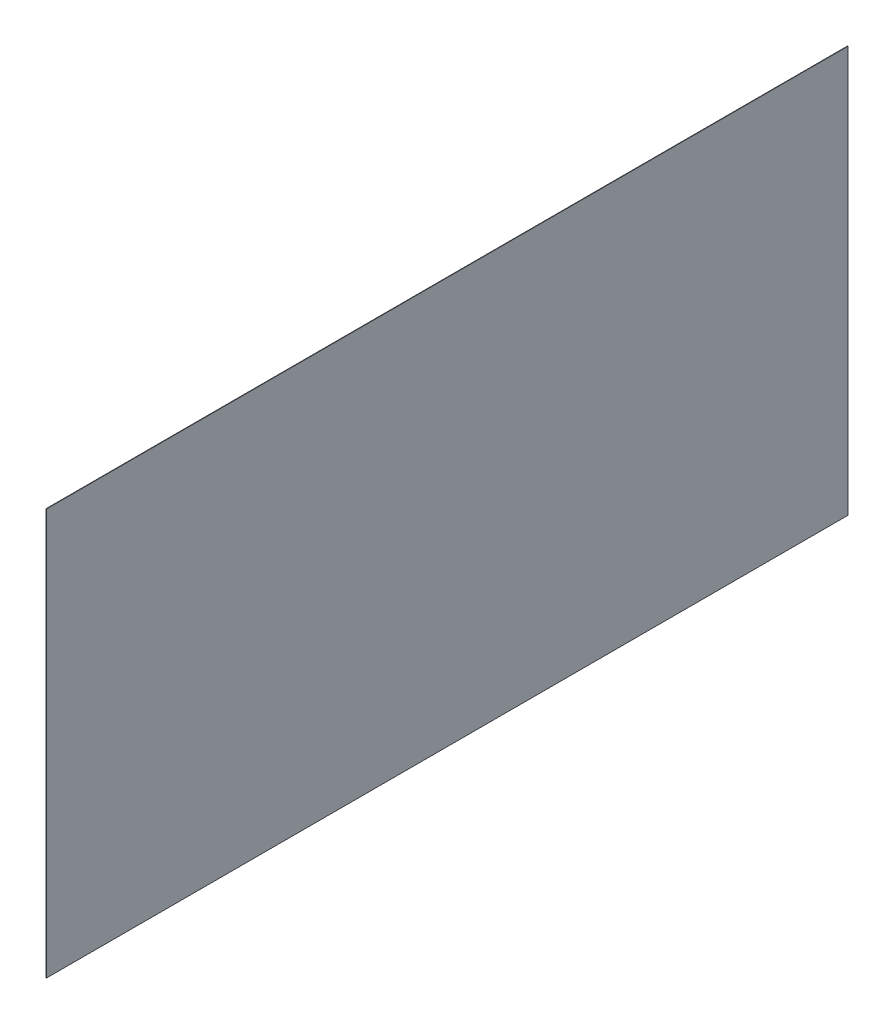
ISO-10303-21;
HEADER;
FILE_DESCRIPTION(('STEP AP214'),'2;1');
FILE_NAME('part.step','',(''),(''),'','','');
FILE_SCHEMA(('AUTOMOTIVE_DESIGN { 1 0 10303 214 1 1 1 1 }'));
ENDSEC;
DATA;
#1=APPLICATION_CONTEXT('core data for automotive mechanical design processes');
#2=APPLICATION_PROTOCOL_DEFINITION('international standard','automotive_design',2000,#1);
#3=PRODUCT_CONTEXT('',#1,'mechanical');
#4=PRODUCT('Part','Part','',(#3));
#5=PRODUCT_RELATED_PRODUCT_CATEGORY('part','',(#4));
#6=PRODUCT_DEFINITION_FORMATION('','',#4);
#7=PRODUCT_DEFINITION_CONTEXT('part definition',#1,'design');
#8=PRODUCT_DEFINITION('design','',#6,#7);
#9=PRODUCT_DEFINITION_SHAPE('','',#8);
#10=(LENGTH_UNIT() NAMED_UNIT(*) SI_UNIT(.MILLI.,.METRE.));
#11=(NAMED_UNIT(*) PLANE_ANGLE_UNIT() SI_UNIT($,.RADIAN.));
#12=(NAMED_UNIT(*) SI_UNIT($,.STERADIAN.) SOLID_ANGLE_UNIT());
#13=UNCERTAINTY_MEASURE_WITH_UNIT(LENGTH_MEASURE(1.E-05),#10,'distance_accuracy_value','');
#14=(GEOMETRIC_REPRESENTATION_CONTEXT(3) GLOBAL_UNCERTAINTY_ASSIGNED_CONTEXT((#13)) GLOBAL_UNIT_ASSIGNED_CONTEXT((#10,
#11,#12)) REPRESENTATION_CONTEXT('',''));
#15=CARTESIAN_POINT('',(0.,0.,0.));
#16=DIRECTION('',(0.,0.,1.));
#17=DIRECTION('',(1.,0.,0.));
#18=AXIS2_PLACEMENT_3D('',#15,#16,#17);
#19=CARTESIAN_POINT('',(-125.4032,-60.,150.));
#20=DIRECTION('',(0.,-1.,0.));
#21=DIRECTION('',(0.,0.,-1.));
#22=AXIS2_PLACEMENT_3D('',#19,#20,#21);
#23=PLANE('',#22);
#24=DIRECTION('',(1.,0.,0.));
#25=VECTOR('',#24,1.);
#26=CARTESIAN_POINT('',(-135.327,-60.,-71.));
#27=LINE('',#26,#25);
#28=CARTESIAN_POINT('',(-125.4032,-60.,-71.));
#29=VERTEX_POINT('',#28);
#30=CARTESIAN_POINT('',(-125.327,-60.,-71.));
#31=VERTEX_POINT('',#30);
#32=EDGE_CURVE('E63',#29,#31,#27,.T.);
#33=ORIENTED_EDGE('',*,*,#32,.T.);
#34=DIRECTION('',(0.,0.,-1.));
#35=VECTOR('',#34,1.);
#36=CARTESIAN_POINT('',(-125.327,-60.,150.));
#37=LINE('',#36,#35);
#38=CARTESIAN_POINT('',(-125.327,-60.,71.));
#39=VERTEX_POINT('',#38);
#40=EDGE_CURVE('E44',#39,#31,#37,.T.);
#41=ORIENTED_EDGE('',*,*,#40,.F.);
#42=DIRECTION('',(1.,0.,0.));
#43=VECTOR('',#42,1.);
#44=CARTESIAN_POINT('',(-135.327,-60.,71.));
#45=LINE('',#44,#43);
#46=CARTESIAN_POINT('',(-125.4032,-60.,71.));
#47=VERTEX_POINT('',#46);
#48=EDGE_CURVE('E55',#47,#39,#45,.T.);
#49=ORIENTED_EDGE('',*,*,#48,.F.);
#50=DIRECTION('',(0.,0.,-1.));
#51=VECTOR('',#50,1.);
#52=CARTESIAN_POINT('',(-125.4032,-60.,150.));
#53=LINE('',#52,#51);
#54=EDGE_CURVE('E11',#47,#29,#53,.T.);
#55=ORIENTED_EDGE('',*,*,#54,.T.);
#56=EDGE_LOOP('',(#33,#41,#49,#55));
#57=FACE_BOUND('',#56,.T.);
#58=ADVANCED_FACE('F41',(#57),#23,.T.);
#59=CARTESIAN_POINT('',(-125.4032,0.,0.));
#60=DIRECTION('',(1.,0.,0.));
#61=DIRECTION('',(0.,0.,-1.));
#62=AXIS2_PLACEMENT_3D('',#59,#60,#61);
#63=PLANE('',#62);
#64=DIRECTION('',(0.,0.,-1.));
#65=VECTOR('',#64,1.);
#66=CARTESIAN_POINT('',(-125.4032,12.,0.));
#67=LINE('',#66,#65);
#68=CARTESIAN_POINT('',(-125.4032,12.,71.));
#69=VERTEX_POINT('',#68);
#70=CARTESIAN_POINT('',(-125.4032,12.,-71.));
#71=VERTEX_POINT('',#70);
#72=EDGE_CURVE('E89',#69,#71,#67,.T.);
#73=ORIENTED_EDGE('',*,*,#72,.T.);
#74=DIRECTION('',(0.,-1.,0.));
#75=VECTOR('',#74,1.);
#76=CARTESIAN_POINT('',(-125.4032,0.,-71.));
#77=LINE('',#76,#75);
#78=EDGE_CURVE('E110',#71,#29,#77,.T.);
#79=ORIENTED_EDGE('',*,*,#78,.T.);
#80=ORIENTED_EDGE('',*,*,#54,.F.);
#81=DIRECTION('',(0.,1.,0.));
#82=VECTOR('',#81,1.);
#83=CARTESIAN_POINT('',(-125.4032,0.,71.));
#84=LINE('',#83,#82);
#85=EDGE_CURVE('E105',#47,#69,#84,.T.);
#86=ORIENTED_EDGE('',*,*,#85,.T.);
#87=EDGE_LOOP('',(#73,#79,#80,#86));
#88=FACE_BOUND('',#87,.T.);
#89=ADVANCED_FACE('F114',(#88),#63,.F.);
#90=CARTESIAN_POINT('',(-125.327,0.,0.));
#91=DIRECTION('',(1.,0.,0.));
#92=DIRECTION('',(0.,0.,-1.));
#93=AXIS2_PLACEMENT_3D('',#90,#91,#92);
#94=PLANE('',#93);
#95=DIRECTION('',(0.,-1.,0.));
#96=VECTOR('',#95,1.);
#97=CARTESIAN_POINT('',(-125.327,12.,-71.));
#98=LINE('',#97,#96);
#99=CARTESIAN_POINT('',(-125.327,12.,-71.));
#100=VERTEX_POINT('',#99);
#101=EDGE_CURVE('E100',#100,#31,#98,.T.);
#102=ORIENTED_EDGE('',*,*,#101,.F.);
#103=DIRECTION('',(0.,0.,-1.));
#104=VECTOR('',#103,1.);
#105=CARTESIAN_POINT('',(-125.327,12.,71.));
#106=LINE('',#105,#104);
#107=CARTESIAN_POINT('',(-125.327,12.,71.));
#108=VERTEX_POINT('',#107);
#109=EDGE_CURVE('E86',#108,#100,#106,.T.);
#110=ORIENTED_EDGE('',*,*,#109,.F.);
#111=DIRECTION('',(0.,1.,0.));
#112=VECTOR('',#111,1.);
#113=CARTESIAN_POINT('',(-125.327,-60.,71.));
#114=LINE('',#113,#112);
#115=EDGE_CURVE('E93',#39,#108,#114,.T.);
#116=ORIENTED_EDGE('',*,*,#115,.F.);
#117=ORIENTED_EDGE('',*,*,#40,.T.);
#118=EDGE_LOOP('',(#102,#110,#116,#117));
#119=FACE_BOUND('',#118,.T.);
#120=ADVANCED_FACE('F99',(#119),#94,.T.);
#121=CARTESIAN_POINT('',(-135.327,12.,-71.));
#122=DIRECTION('',(0.,0.,1.));
#123=DIRECTION('',(1.,0.,0.));
#124=AXIS2_PLACEMENT_3D('',#121,#122,#123);
#125=PLANE('',#124);
#126=DIRECTION('',(1.,0.,0.));
#127=VECTOR('',#126,1.);
#128=CARTESIAN_POINT('',(-135.327,12.,-71.));
#129=LINE('',#128,#127);
#130=EDGE_CURVE('E91',#71,#100,#129,.T.);
#131=ORIENTED_EDGE('',*,*,#130,.T.);
#132=ORIENTED_EDGE('',*,*,#101,.T.);
#133=ORIENTED_EDGE('',*,*,#32,.F.);
#134=ORIENTED_EDGE('',*,*,#78,.F.);
#135=EDGE_LOOP('',(#131,#132,#133,#134));
#136=FACE_BOUND('',#135,.T.);
#137=ADVANCED_FACE('F121',(#136),#125,.F.);
#138=CARTESIAN_POINT('',(-135.327,12.,71.));
#139=DIRECTION('',(0.,-1.,0.));
#140=DIRECTION('',(0.,0.,-1.));
#141=AXIS2_PLACEMENT_3D('',#138,#139,#140);
#142=PLANE('',#141);
#143=DIRECTION('',(1.,0.,0.));
#144=VECTOR('',#143,1.);
#145=CARTESIAN_POINT('',(-135.327,12.,71.));
#146=LINE('',#145,#144);
#147=EDGE_CURVE('E82',#69,#108,#146,.T.);
#148=ORIENTED_EDGE('',*,*,#147,.T.);
#149=ORIENTED_EDGE('',*,*,#109,.T.);
#150=ORIENTED_EDGE('',*,*,#130,.F.);
#151=ORIENTED_EDGE('',*,*,#72,.F.);
#152=EDGE_LOOP('',(#148,#149,#150,#151));
#153=FACE_BOUND('',#152,.T.);
#154=ADVANCED_FACE('F83',(#153),#142,.F.);
#155=CARTESIAN_POINT('',(-135.327,-60.,71.));
#156=DIRECTION('',(0.,0.,-1.));
#157=DIRECTION('',(-1.,0.,0.));
#158=AXIS2_PLACEMENT_3D('',#155,#156,#157);
#159=PLANE('',#158);
#160=ORIENTED_EDGE('',*,*,#48,.T.);
#161=ORIENTED_EDGE('',*,*,#115,.T.);
#162=ORIENTED_EDGE('',*,*,#147,.F.);
#163=ORIENTED_EDGE('',*,*,#85,.F.);
#164=EDGE_LOOP('',(#160,#161,#162,#163));
#165=FACE_BOUND('',#164,.T.);
#166=ADVANCED_FACE('F94',(#165),#159,.F.);
#167=CLOSED_SHELL('',(#58,#89,#120,#137,#154,#166));
#168=MANIFOLD_SOLID_BREP('B2',#167);
#169=ADVANCED_BREP_SHAPE_REPRESENTATION('',(#18,#168),#14);
#170=SHAPE_DEFINITION_REPRESENTATION(#9,#169);
ENDSEC;
END-ISO-10303-21;
